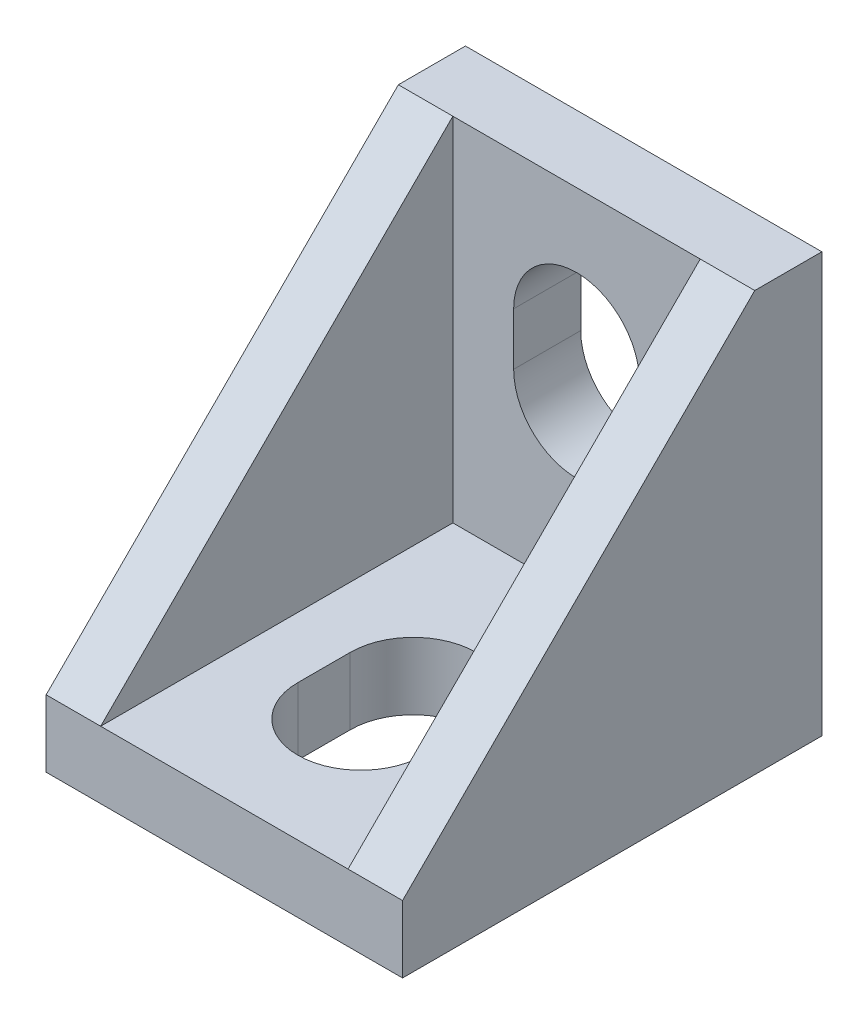
ISO-10303-21;
HEADER;
FILE_DESCRIPTION(('STEP AP214'),'2;1');
FILE_NAME('part.step','',(''),(''),'','','');
FILE_SCHEMA(('AUTOMOTIVE_DESIGN { 1 0 10303 214 1 1 1 1 }'));
ENDSEC;
DATA;
#1=APPLICATION_CONTEXT('core data for automotive mechanical design processes');
#2=APPLICATION_PROTOCOL_DEFINITION('international standard','automotive_design',2000,#1);
#3=PRODUCT_CONTEXT('',#1,'mechanical');
#4=PRODUCT('Part','Part','',(#3));
#5=PRODUCT_RELATED_PRODUCT_CATEGORY('part','',(#4));
#6=PRODUCT_DEFINITION_FORMATION('','',#4);
#7=PRODUCT_DEFINITION_CONTEXT('part definition',#1,'design');
#8=PRODUCT_DEFINITION('design','',#6,#7);
#9=PRODUCT_DEFINITION_SHAPE('','',#8);
#10=(LENGTH_UNIT() NAMED_UNIT(*) SI_UNIT(.MILLI.,.METRE.));
#11=(NAMED_UNIT(*) PLANE_ANGLE_UNIT() SI_UNIT($,.RADIAN.));
#12=(NAMED_UNIT(*) SI_UNIT($,.STERADIAN.) SOLID_ANGLE_UNIT());
#13=UNCERTAINTY_MEASURE_WITH_UNIT(LENGTH_MEASURE(1.E-05),#10,'distance_accuracy_value','');
#14=(GEOMETRIC_REPRESENTATION_CONTEXT(3) GLOBAL_UNCERTAINTY_ASSIGNED_CONTEXT((#13)) GLOBAL_UNIT_ASSIGNED_CONTEXT((#10,
#11,#12)) REPRESENTATION_CONTEXT('',''));
#15=CARTESIAN_POINT('',(0.,0.,0.));
#16=DIRECTION('',(0.,0.,1.));
#17=DIRECTION('',(1.,0.,0.));
#18=AXIS2_PLACEMENT_3D('',#15,#16,#17);
#19=CARTESIAN_POINT('',(-8.5,-6.8,20.));
#20=DIRECTION('',(0.,-1.,0.));
#21=DIRECTION('',(0.,0.,-1.));
#22=AXIS2_PLACEMENT_3D('',#19,#20,#21);
#23=PLANE('',#22);
#24=DIRECTION('',(0.,0.,1.));
#25=VECTOR('',#24,1.);
#26=CARTESIAN_POINT('',(5.9,-6.8,20.));
#27=LINE('',#26,#25);
#28=CARTESIAN_POINT('',(5.9,-6.8,3.2));
#29=VERTEX_POINT('',#28);
#30=CARTESIAN_POINT('',(5.9,-6.8,20.));
#31=VERTEX_POINT('',#30);
#32=EDGE_CURVE('E220',#29,#31,#27,.T.);
#33=ORIENTED_EDGE('',*,*,#32,.F.);
#34=DIRECTION('',(-1.,0.,0.));
#35=VECTOR('',#34,1.);
#36=CARTESIAN_POINT('',(-8.5,-6.8,3.2));
#37=LINE('',#36,#35);
#38=CARTESIAN_POINT('',(-5.9,-6.8,3.2));
#39=VERTEX_POINT('',#38);
#40=EDGE_CURVE('E38',#29,#39,#37,.T.);
#41=ORIENTED_EDGE('',*,*,#40,.T.);
#42=DIRECTION('',(0.,0.,1.));
#43=VECTOR('',#42,1.);
#44=CARTESIAN_POINT('',(-5.9,-6.8,20.));
#45=LINE('',#44,#43);
#46=CARTESIAN_POINT('',(-5.9,-6.8,20.));
#47=VERTEX_POINT('',#46);
#48=EDGE_CURVE('E228',#39,#47,#45,.T.);
#49=ORIENTED_EDGE('',*,*,#48,.T.);
#50=DIRECTION('',(-1.,0.,0.));
#51=VECTOR('',#50,1.);
#52=CARTESIAN_POINT('',(-8.5,-6.8,20.));
#53=LINE('',#52,#51);
#54=EDGE_CURVE('E250',#31,#47,#53,.T.);
#55=ORIENTED_EDGE('',*,*,#54,.F.);
#56=EDGE_LOOP('',(#33,#41,#49,#55));
#57=FACE_BOUND('',#56,.T.);
#58=CARTESIAN_POINT('',(0.,-6.8,13.4950710758014));
#59=DIRECTION('',(0.,-1.,0.));
#60=DIRECTION('',(1.,0.,0.));
#61=AXIS2_PLACEMENT_3D('',#58,#59,#60);
#62=CIRCLE('',#61,3.);
#63=CARTESIAN_POINT('',(3.,-6.8,13.4950710758014));
#64=VERTEX_POINT('',#63);
#65=CARTESIAN_POINT('',(-3.,-6.8,13.4950710758014));
#66=VERTEX_POINT('',#65);
#67=EDGE_CURVE('E51',#64,#66,#62,.T.);
#68=ORIENTED_EDGE('',*,*,#67,.T.);
#69=DIRECTION('',(0.,0.,-1.));
#70=VECTOR('',#69,1.);
#71=CARTESIAN_POINT('',(-3.,-6.8,13.4950710758014));
#72=LINE('',#71,#70);
#73=CARTESIAN_POINT('',(-3.,-6.8,10.9950710758014));
#74=VERTEX_POINT('',#73);
#75=EDGE_CURVE('E165',#66,#74,#72,.T.);
#76=ORIENTED_EDGE('',*,*,#75,.T.);
#77=CARTESIAN_POINT('',(0.,-6.8,10.9950710758014));
#78=DIRECTION('',(0.,-1.,0.));
#79=DIRECTION('',(1.,0.,0.));
#80=AXIS2_PLACEMENT_3D('',#77,#78,#79);
#81=CIRCLE('',#80,3.);
#82=CARTESIAN_POINT('',(3.,-6.8,10.9950710758014));
#83=VERTEX_POINT('',#82);
#84=EDGE_CURVE('E168',#74,#83,#81,.T.);
#85=ORIENTED_EDGE('',*,*,#84,.T.);
#86=DIRECTION('',(0.,0.,1.));
#87=VECTOR('',#86,1.);
#88=CARTESIAN_POINT('',(3.,-6.8,13.4950710758014));
#89=LINE('',#88,#87);
#90=EDGE_CURVE('E174',#83,#64,#89,.T.);
#91=ORIENTED_EDGE('',*,*,#90,.T.);
#92=EDGE_LOOP('',(#68,#76,#85,#91));
#93=FACE_BOUND('',#92,.T.);
#94=ADVANCED_FACE('F34',(#57,#93),#23,.F.);
#95=CARTESIAN_POINT('',(-8.5,-10.,3.2));
#96=DIRECTION('',(0.,1.,0.));
#97=DIRECTION('',(0.,0.,1.));
#98=AXIS2_PLACEMENT_3D('',#95,#96,#97);
#99=PLANE('',#98);
#100=DIRECTION('',(1.,0.,0.));
#101=VECTOR('',#100,1.);
#102=CARTESIAN_POINT('',(-8.5,-10.,0.));
#103=LINE('',#102,#101);
#104=CARTESIAN_POINT('',(-8.5,-10.,0.));
#105=VERTEX_POINT('',#104);
#106=CARTESIAN_POINT('',(8.5,-10.,0.));
#107=VERTEX_POINT('',#106);
#108=EDGE_CURVE('E267',#105,#107,#103,.T.);
#109=ORIENTED_EDGE('',*,*,#108,.T.);
#110=DIRECTION('',(0.,0.,-1.));
#111=VECTOR('',#110,1.);
#112=CARTESIAN_POINT('',(8.5,-10.,3.2));
#113=LINE('',#112,#111);
#114=CARTESIAN_POINT('',(8.5,-10.,20.));
#115=VERTEX_POINT('',#114);
#116=EDGE_CURVE('E259',#115,#107,#113,.T.);
#117=ORIENTED_EDGE('',*,*,#116,.F.);
#118=DIRECTION('',(1.,0.,0.));
#119=VECTOR('',#118,1.);
#120=CARTESIAN_POINT('',(-8.5,-10.,20.));
#121=LINE('',#120,#119);
#122=CARTESIAN_POINT('',(-8.5,-10.,20.));
#123=VERTEX_POINT('',#122);
#124=EDGE_CURVE('E244',#123,#115,#121,.T.);
#125=ORIENTED_EDGE('',*,*,#124,.F.);
#126=DIRECTION('',(0.,0.,-1.));
#127=VECTOR('',#126,1.);
#128=CARTESIAN_POINT('',(-8.5,-10.,3.2));
#129=LINE('',#128,#127);
#130=EDGE_CURVE('E271',#123,#105,#129,.T.);
#131=ORIENTED_EDGE('',*,*,#130,.T.);
#132=EDGE_LOOP('',(#109,#117,#125,#131));
#133=FACE_BOUND('',#132,.T.);
#134=CARTESIAN_POINT('',(0.,-10.,13.4950710758014));
#135=DIRECTION('',(0.,-1.,0.));
#136=DIRECTION('',(1.,0.,0.));
#137=AXIS2_PLACEMENT_3D('',#134,#135,#136);
#138=CIRCLE('',#137,3.);
#139=CARTESIAN_POINT('',(3.,-10.,13.4950710758014));
#140=VERTEX_POINT('',#139);
#141=CARTESIAN_POINT('',(-3.,-10.,13.4950710758014));
#142=VERTEX_POINT('',#141);
#143=EDGE_CURVE('E157',#140,#142,#138,.T.);
#144=ORIENTED_EDGE('',*,*,#143,.F.);
#145=DIRECTION('',(0.,0.,1.));
#146=VECTOR('',#145,1.);
#147=CARTESIAN_POINT('',(3.,-10.,13.4950710758014));
#148=LINE('',#147,#146);
#149=CARTESIAN_POINT('',(3.,-10.,10.9950710758014));
#150=VERTEX_POINT('',#149);
#151=EDGE_CURVE('E149',#150,#140,#148,.T.);
#152=ORIENTED_EDGE('',*,*,#151,.F.);
#153=CARTESIAN_POINT('',(0.,-10.,10.9950710758014));
#154=DIRECTION('',(0.,-1.,0.));
#155=DIRECTION('',(1.,0.,0.));
#156=AXIS2_PLACEMENT_3D('',#153,#154,#155);
#157=CIRCLE('',#156,3.);
#158=CARTESIAN_POINT('',(-3.,-10.,10.9950710758014));
#159=VERTEX_POINT('',#158);
#160=EDGE_CURVE('E156',#159,#150,#157,.T.);
#161=ORIENTED_EDGE('',*,*,#160,.F.);
#162=DIRECTION('',(0.,0.,-1.));
#163=VECTOR('',#162,1.);
#164=CARTESIAN_POINT('',(-3.,-10.,13.4950710758014));
#165=LINE('',#164,#163);
#166=EDGE_CURVE('E161',#142,#159,#165,.T.);
#167=ORIENTED_EDGE('',*,*,#166,.F.);
#168=EDGE_LOOP('',(#144,#152,#161,#167));
#169=FACE_BOUND('',#168,.T.);
#170=ADVANCED_FACE('F164',(#133,#169),#99,.F.);
#171=CARTESIAN_POINT('',(8.5,-10.,3.2));
#172=DIRECTION('',(0.,0.,1.));
#173=DIRECTION('',(1.,0.,0.));
#174=AXIS2_PLACEMENT_3D('',#171,#172,#173);
#175=PLANE('',#174);
#176=CARTESIAN_POINT('',(0.,3.49507107580138,3.2));
#177=DIRECTION('',(0.,0.,1.));
#178=DIRECTION('',(1.,0.,0.));
#179=AXIS2_PLACEMENT_3D('',#176,#177,#178);
#180=CIRCLE('',#179,3.);
#181=CARTESIAN_POINT('',(3.,3.49507107580138,3.2));
#182=VERTEX_POINT('',#181);
#183=CARTESIAN_POINT('',(-3.,3.49507107580138,3.2));
#184=VERTEX_POINT('',#183);
#185=EDGE_CURVE('E180',#182,#184,#180,.T.);
#186=ORIENTED_EDGE('',*,*,#185,.F.);
#187=DIRECTION('',(0.,1.,0.));
#188=VECTOR('',#187,1.);
#189=CARTESIAN_POINT('',(3.,3.49507107580138,3.2));
#190=LINE('',#189,#188);
#191=CARTESIAN_POINT('',(3.,0.995071075801377,3.2));
#192=VERTEX_POINT('',#191);
#193=EDGE_CURVE('E188',#192,#182,#190,.T.);
#194=ORIENTED_EDGE('',*,*,#193,.F.);
#195=CARTESIAN_POINT('',(0.,0.995071075801377,3.2));
#196=DIRECTION('',(0.,0.,1.));
#197=DIRECTION('',(1.,0.,0.));
#198=AXIS2_PLACEMENT_3D('',#195,#196,#197);
#199=CIRCLE('',#198,3.);
#200=CARTESIAN_POINT('',(-3.,0.995071075801377,3.2));
#201=VERTEX_POINT('',#200);
#202=EDGE_CURVE('E202',#201,#192,#199,.T.);
#203=ORIENTED_EDGE('',*,*,#202,.F.);
#204=DIRECTION('',(0.,-1.,0.));
#205=VECTOR('',#204,1.);
#206=CARTESIAN_POINT('',(-3.,3.49507107580138,3.2));
#207=LINE('',#206,#205);
#208=EDGE_CURVE('E199',#184,#201,#207,.T.);
#209=ORIENTED_EDGE('',*,*,#208,.F.);
#210=EDGE_LOOP('',(#186,#194,#203,#209));
#211=FACE_BOUND('',#210,.T.);
#212=ORIENTED_EDGE('',*,*,#40,.F.);
#213=DIRECTION('',(0.,-1.,0.));
#214=VECTOR('',#213,1.);
#215=CARTESIAN_POINT('',(5.9,-6.8,3.2));
#216=LINE('',#215,#214);
#217=CARTESIAN_POINT('',(5.9,10.,3.2));
#218=VERTEX_POINT('',#217);
#219=EDGE_CURVE('E216',#218,#29,#216,.T.);
#220=ORIENTED_EDGE('',*,*,#219,.F.);
#221=DIRECTION('',(-1.,0.,0.));
#222=VECTOR('',#221,1.);
#223=CARTESIAN_POINT('',(-8.5,10.,3.2));
#224=LINE('',#223,#222);
#225=CARTESIAN_POINT('',(-5.9,10.,3.2));
#226=VERTEX_POINT('',#225);
#227=EDGE_CURVE('E260',#218,#226,#224,.T.);
#228=ORIENTED_EDGE('',*,*,#227,.T.);
#229=DIRECTION('',(0.,-1.,0.));
#230=VECTOR('',#229,1.);
#231=CARTESIAN_POINT('',(-5.9,-6.8,3.2));
#232=LINE('',#231,#230);
#233=EDGE_CURVE('E225',#226,#39,#232,.T.);
#234=ORIENTED_EDGE('',*,*,#233,.T.);
#235=EDGE_LOOP('',(#212,#220,#228,#234));
#236=FACE_BOUND('',#235,.T.);
#237=ADVANCED_FACE('F309',(#211,#236),#175,.T.);
#238=CARTESIAN_POINT('',(8.5,10.,3.2));
#239=DIRECTION('',(-1.,0.,0.));
#240=DIRECTION('',(0.,-1.,0.));
#241=AXIS2_PLACEMENT_3D('',#238,#239,#240);
#242=PLANE('',#241);
#243=DIRECTION('',(0.,0.,-1.));
#244=VECTOR('',#243,1.);
#245=CARTESIAN_POINT('',(8.5,10.,3.2));
#246=LINE('',#245,#244);
#247=CARTESIAN_POINT('',(8.5,10.,3.2));
#248=VERTEX_POINT('',#247);
#249=CARTESIAN_POINT('',(8.5,10.,0.));
#250=VERTEX_POINT('',#249);
#251=EDGE_CURVE('E11',#248,#250,#246,.T.);
#252=ORIENTED_EDGE('',*,*,#251,.F.);
#253=DIRECTION('',(0.,0.707106781186548,-0.707106781186548));
#254=VECTOR('',#253,1.);
#255=CARTESIAN_POINT('',(8.5,10.,3.2));
#256=LINE('',#255,#254);
#257=CARTESIAN_POINT('',(8.5,-6.8,20.));
#258=VERTEX_POINT('',#257);
#259=EDGE_CURVE('E209',#258,#248,#256,.T.);
#260=ORIENTED_EDGE('',*,*,#259,.F.);
#261=DIRECTION('',(0.,1.,0.));
#262=VECTOR('',#261,1.);
#263=CARTESIAN_POINT('',(8.5,-10.,20.));
#264=LINE('',#263,#262);
#265=EDGE_CURVE('E247',#115,#258,#264,.T.);
#266=ORIENTED_EDGE('',*,*,#265,.F.);
#267=ORIENTED_EDGE('',*,*,#116,.T.);
#268=DIRECTION('',(0.,1.,0.));
#269=VECTOR('',#268,1.);
#270=CARTESIAN_POINT('',(8.5,10.,0.));
#271=LINE('',#270,#269);
#272=EDGE_CURVE('E253',#107,#250,#271,.T.);
#273=ORIENTED_EDGE('',*,*,#272,.T.);
#274=EDGE_LOOP('',(#252,#260,#266,#267,#273));
#275=FACE_BOUND('',#274,.T.);
#276=ADVANCED_FACE('F36',(#275),#242,.F.);
#277=CARTESIAN_POINT('',(-8.5,10.,3.2));
#278=DIRECTION('',(0.,-1.,0.));
#279=DIRECTION('',(0.,0.,-1.));
#280=AXIS2_PLACEMENT_3D('',#277,#278,#279);
#281=PLANE('',#280);
#282=DIRECTION('',(-1.,0.,0.));
#283=VECTOR('',#282,1.);
#284=CARTESIAN_POINT('',(-8.5,10.,0.));
#285=LINE('',#284,#283);
#286=CARTESIAN_POINT('',(-8.5,10.,0.));
#287=VERTEX_POINT('',#286);
#288=EDGE_CURVE('E263',#250,#287,#285,.T.);
#289=ORIENTED_EDGE('',*,*,#288,.T.);
#290=DIRECTION('',(0.,0.,-1.));
#291=VECTOR('',#290,1.);
#292=CARTESIAN_POINT('',(-8.5,10.,3.2));
#293=LINE('',#292,#291);
#294=CARTESIAN_POINT('',(-8.5,10.,3.2));
#295=VERTEX_POINT('',#294);
#296=EDGE_CURVE('E44',#295,#287,#293,.T.);
#297=ORIENTED_EDGE('',*,*,#296,.F.);
#298=DIRECTION('',(-1.,0.,0.));
#299=VECTOR('',#298,1.);
#300=CARTESIAN_POINT('',(-5.9,10.,3.2));
#301=LINE('',#300,#299);
#302=EDGE_CURVE('E237',#226,#295,#301,.T.);
#303=ORIENTED_EDGE('',*,*,#302,.F.);
#304=ORIENTED_EDGE('',*,*,#227,.F.);
#305=EDGE_CURVE('E256',#248,#218,#224,.T.);
#306=ORIENTED_EDGE('',*,*,#305,.F.);
#307=ORIENTED_EDGE('',*,*,#251,.T.);
#308=EDGE_LOOP('',(#289,#297,#303,#304,#306,#307));
#309=FACE_BOUND('',#308,.T.);
#310=ADVANCED_FACE('F312',(#309),#281,.F.);
#311=CARTESIAN_POINT('',(-8.5,10.,3.2));
#312=DIRECTION('',(1.,0.,0.));
#313=DIRECTION('',(0.,1.,0.));
#314=AXIS2_PLACEMENT_3D('',#311,#312,#313);
#315=PLANE('',#314);
#316=DIRECTION('',(0.,-1.,0.));
#317=VECTOR('',#316,1.);
#318=CARTESIAN_POINT('',(-8.5,10.,0.));
#319=LINE('',#318,#317);
#320=EDGE_CURVE('E265',#287,#105,#319,.T.);
#321=ORIENTED_EDGE('',*,*,#320,.T.);
#322=ORIENTED_EDGE('',*,*,#130,.F.);
#323=DIRECTION('',(0.,-1.,0.));
#324=VECTOR('',#323,1.);
#325=CARTESIAN_POINT('',(-8.5,-10.,20.));
#326=LINE('',#325,#324);
#327=CARTESIAN_POINT('',(-8.5,-6.8,20.));
#328=VERTEX_POINT('',#327);
#329=EDGE_CURVE('E241',#328,#123,#326,.T.);
#330=ORIENTED_EDGE('',*,*,#329,.F.);
#331=DIRECTION('',(0.,0.707106781186548,-0.707106781186548));
#332=VECTOR('',#331,1.);
#333=CARTESIAN_POINT('',(-8.5,10.,3.2));
#334=LINE('',#333,#332);
#335=EDGE_CURVE('E223',#328,#295,#334,.T.);
#336=ORIENTED_EDGE('',*,*,#335,.T.);
#337=ORIENTED_EDGE('',*,*,#296,.T.);
#338=EDGE_LOOP('',(#321,#322,#330,#336,#337));
#339=FACE_BOUND('',#338,.T.);
#340=ADVANCED_FACE('F278',(#339),#315,.F.);
#341=CARTESIAN_POINT('',(8.5,-10.,0.));
#342=DIRECTION('',(0.,0.,1.));
#343=DIRECTION('',(1.,0.,0.));
#344=AXIS2_PLACEMENT_3D('',#341,#342,#343);
#345=PLANE('',#344);
#346=DIRECTION('',(0.,1.,0.));
#347=VECTOR('',#346,1.);
#348=CARTESIAN_POINT('',(3.,3.49507107580138,0.));
#349=LINE('',#348,#347);
#350=CARTESIAN_POINT('',(3.,0.995071075801377,0.));
#351=VERTEX_POINT('',#350);
#352=CARTESIAN_POINT('',(3.,3.49507107580138,0.));
#353=VERTEX_POINT('',#352);
#354=EDGE_CURVE('E194',#351,#353,#349,.T.);
#355=ORIENTED_EDGE('',*,*,#354,.T.);
#356=CARTESIAN_POINT('',(0.,3.49507107580138,0.));
#357=DIRECTION('',(0.,0.,1.));
#358=DIRECTION('',(1.,0.,0.));
#359=AXIS2_PLACEMENT_3D('',#356,#357,#358);
#360=CIRCLE('',#359,3.);
#361=CARTESIAN_POINT('',(-3.,3.49507107580138,0.));
#362=VERTEX_POINT('',#361);
#363=EDGE_CURVE('E184',#353,#362,#360,.T.);
#364=ORIENTED_EDGE('',*,*,#363,.T.);
#365=DIRECTION('',(0.,-1.,0.));
#366=VECTOR('',#365,1.);
#367=CARTESIAN_POINT('',(-3.,3.49507107580138,0.));
#368=LINE('',#367,#366);
#369=CARTESIAN_POINT('',(-3.,0.995071075801377,0.));
#370=VERTEX_POINT('',#369);
#371=EDGE_CURVE('E187',#362,#370,#368,.T.);
#372=ORIENTED_EDGE('',*,*,#371,.T.);
#373=CARTESIAN_POINT('',(0.,0.995071075801377,0.));
#374=DIRECTION('',(0.,0.,1.));
#375=DIRECTION('',(1.,0.,0.));
#376=AXIS2_PLACEMENT_3D('',#373,#374,#375);
#377=CIRCLE('',#376,3.);
#378=EDGE_CURVE('E191',#370,#351,#377,.T.);
#379=ORIENTED_EDGE('',*,*,#378,.T.);
#380=EDGE_LOOP('',(#355,#364,#372,#379));
#381=FACE_BOUND('',#380,.T.);
#382=ORIENTED_EDGE('',*,*,#272,.F.);
#383=ORIENTED_EDGE('',*,*,#108,.F.);
#384=ORIENTED_EDGE('',*,*,#320,.F.);
#385=ORIENTED_EDGE('',*,*,#288,.F.);
#386=EDGE_LOOP('',(#382,#383,#384,#385));
#387=FACE_BOUND('',#386,.T.);
#388=ADVANCED_FACE('F285',(#381,#387),#345,.F.);
#389=CARTESIAN_POINT('',(-8.5,-6.8,20.));
#390=DIRECTION('',(0.,0.,-1.));
#391=DIRECTION('',(-1.,0.,0.));
#392=AXIS2_PLACEMENT_3D('',#389,#390,#391);
#393=PLANE('',#392);
#394=ORIENTED_EDGE('',*,*,#329,.T.);
#395=ORIENTED_EDGE('',*,*,#124,.T.);
#396=ORIENTED_EDGE('',*,*,#265,.T.);
#397=EDGE_CURVE('E251',#258,#31,#53,.T.);
#398=ORIENTED_EDGE('',*,*,#397,.T.);
#399=ORIENTED_EDGE('',*,*,#54,.T.);
#400=DIRECTION('',(-1.,0.,0.));
#401=VECTOR('',#400,1.);
#402=CARTESIAN_POINT('',(-5.9,-6.8,20.));
#403=LINE('',#402,#401);
#404=EDGE_CURVE('E234',#47,#328,#403,.T.);
#405=ORIENTED_EDGE('',*,*,#404,.T.);
#406=EDGE_LOOP('',(#394,#395,#396,#398,#399,#405));
#407=FACE_BOUND('',#406,.T.);
#408=ADVANCED_FACE('F293',(#407),#393,.F.);
#409=CARTESIAN_POINT('',(-5.9,10.,3.2));
#410=DIRECTION('',(0.,0.707106781186548,0.707106781186548));
#411=DIRECTION('',(0.,-0.707106781186548,0.707106781186548));
#412=AXIS2_PLACEMENT_3D('',#409,#410,#411);
#413=PLANE('',#412);
#414=ORIENTED_EDGE('',*,*,#335,.F.);
#415=ORIENTED_EDGE('',*,*,#404,.F.);
#416=DIRECTION('',(0.,0.707106781186548,-0.707106781186548));
#417=VECTOR('',#416,1.);
#418=CARTESIAN_POINT('',(-5.9,10.,3.2));
#419=LINE('',#418,#417);
#420=EDGE_CURVE('E231',#47,#226,#419,.T.);
#421=ORIENTED_EDGE('',*,*,#420,.T.);
#422=ORIENTED_EDGE('',*,*,#302,.T.);
#423=EDGE_LOOP('',(#414,#415,#421,#422));
#424=FACE_BOUND('',#423,.T.);
#425=ADVANCED_FACE('F298',(#424),#413,.T.);
#426=CARTESIAN_POINT('',(-5.9,-6.8,3.2));
#427=DIRECTION('',(-1.,0.,0.));
#428=DIRECTION('',(0.,-1.,0.));
#429=AXIS2_PLACEMENT_3D('',#426,#427,#428);
#430=PLANE('',#429);
#431=ORIENTED_EDGE('',*,*,#233,.F.);
#432=ORIENTED_EDGE('',*,*,#420,.F.);
#433=ORIENTED_EDGE('',*,*,#48,.F.);
#434=EDGE_LOOP('',(#431,#432,#433));
#435=FACE_BOUND('',#434,.T.);
#436=ADVANCED_FACE('F302',(#435),#430,.F.);
#437=CARTESIAN_POINT('',(5.9,10.,3.2));
#438=DIRECTION('',(0.,-0.707106781186548,-0.707106781186548));
#439=DIRECTION('',(0.,0.707106781186548,-0.707106781186548));
#440=AXIS2_PLACEMENT_3D('',#437,#438,#439);
#441=PLANE('',#440);
#442=ORIENTED_EDGE('',*,*,#259,.T.);
#443=ORIENTED_EDGE('',*,*,#305,.T.);
#444=DIRECTION('',(0.,0.707106781186548,-0.707106781186548));
#445=VECTOR('',#444,1.);
#446=CARTESIAN_POINT('',(5.9,10.,3.2));
#447=LINE('',#446,#445);
#448=EDGE_CURVE('E218',#31,#218,#447,.T.);
#449=ORIENTED_EDGE('',*,*,#448,.F.);
#450=ORIENTED_EDGE('',*,*,#397,.F.);
#451=EDGE_LOOP('',(#442,#443,#449,#450));
#452=FACE_BOUND('',#451,.T.);
#453=ADVANCED_FACE('F314',(#452),#441,.F.);
#454=CARTESIAN_POINT('',(5.9,-6.8,3.2));
#455=DIRECTION('',(1.,0.,0.));
#456=DIRECTION('',(0.,-1.,0.));
#457=AXIS2_PLACEMENT_3D('',#454,#455,#456);
#458=PLANE('',#457);
#459=ORIENTED_EDGE('',*,*,#219,.T.);
#460=ORIENTED_EDGE('',*,*,#32,.T.);
#461=ORIENTED_EDGE('',*,*,#448,.T.);
#462=EDGE_LOOP('',(#459,#460,#461));
#463=FACE_BOUND('',#462,.T.);
#464=ADVANCED_FACE('F316',(#463),#458,.F.);
#465=CARTESIAN_POINT('',(0.,3.49507107580138,0.));
#466=DIRECTION('',(0.,0.,1.));
#467=DIRECTION('',(1.,0.,0.));
#468=AXIS2_PLACEMENT_3D('',#465,#466,#467);
#469=CYLINDRICAL_SURFACE('',#468,3.);
#470=ORIENTED_EDGE('',*,*,#185,.T.);
#471=DIRECTION('',(0.,0.,1.));
#472=VECTOR('',#471,1.);
#473=CARTESIAN_POINT('',(-3.,3.49507107580138,0.));
#474=LINE('',#473,#472);
#475=EDGE_CURVE('E197',#362,#184,#474,.T.);
#476=ORIENTED_EDGE('',*,*,#475,.F.);
#477=ORIENTED_EDGE('',*,*,#363,.F.);
#478=DIRECTION('',(0.,0.,1.));
#479=VECTOR('',#478,1.);
#480=CARTESIAN_POINT('',(3.,3.49507107580138,0.));
#481=LINE('',#480,#479);
#482=EDGE_CURVE('E207',#353,#182,#481,.T.);
#483=ORIENTED_EDGE('',*,*,#482,.T.);
#484=EDGE_LOOP('',(#470,#476,#477,#483));
#485=FACE_BOUND('',#484,.T.);
#486=ADVANCED_FACE('F318',(#485),#469,.F.);
#487=CARTESIAN_POINT('',(3.,3.49507107580138,0.));
#488=DIRECTION('',(1.,0.,0.));
#489=DIRECTION('',(0.,1.,0.));
#490=AXIS2_PLACEMENT_3D('',#487,#488,#489);
#491=PLANE('',#490);
#492=ORIENTED_EDGE('',*,*,#193,.T.);
#493=ORIENTED_EDGE('',*,*,#482,.F.);
#494=ORIENTED_EDGE('',*,*,#354,.F.);
#495=DIRECTION('',(0.,0.,1.));
#496=VECTOR('',#495,1.);
#497=CARTESIAN_POINT('',(3.,0.995071075801377,0.));
#498=LINE('',#497,#496);
#499=EDGE_CURVE('E210',#351,#192,#498,.T.);
#500=ORIENTED_EDGE('',*,*,#499,.T.);
#501=EDGE_LOOP('',(#492,#493,#494,#500));
#502=FACE_BOUND('',#501,.T.);
#503=ADVANCED_FACE('F324',(#502),#491,.F.);
#504=CARTESIAN_POINT('',(0.,0.995071075801377,0.));
#505=DIRECTION('',(0.,0.,1.));
#506=DIRECTION('',(1.,0.,0.));
#507=AXIS2_PLACEMENT_3D('',#504,#505,#506);
#508=CYLINDRICAL_SURFACE('',#507,3.);
#509=ORIENTED_EDGE('',*,*,#202,.T.);
#510=ORIENTED_EDGE('',*,*,#499,.F.);
#511=ORIENTED_EDGE('',*,*,#378,.F.);
#512=DIRECTION('',(0.,0.,1.));
#513=VECTOR('',#512,1.);
#514=CARTESIAN_POINT('',(-3.,0.995071075801377,0.));
#515=LINE('',#514,#513);
#516=EDGE_CURVE('E212',#370,#201,#515,.T.);
#517=ORIENTED_EDGE('',*,*,#516,.T.);
#518=EDGE_LOOP('',(#509,#510,#511,#517));
#519=FACE_BOUND('',#518,.T.);
#520=ADVANCED_FACE('F409',(#519),#508,.F.);
#521=CARTESIAN_POINT('',(-3.,3.49507107580138,0.));
#522=DIRECTION('',(-1.,0.,0.));
#523=DIRECTION('',(0.,-1.,0.));
#524=AXIS2_PLACEMENT_3D('',#521,#522,#523);
#525=PLANE('',#524);
#526=ORIENTED_EDGE('',*,*,#208,.T.);
#527=ORIENTED_EDGE('',*,*,#516,.F.);
#528=ORIENTED_EDGE('',*,*,#371,.F.);
#529=ORIENTED_EDGE('',*,*,#475,.T.);
#530=EDGE_LOOP('',(#526,#527,#528,#529));
#531=FACE_BOUND('',#530,.T.);
#532=ADVANCED_FACE('F374',(#531),#525,.F.);
#533=CARTESIAN_POINT('',(0.,-10.,13.4950710758014));
#534=DIRECTION('',(0.,1.,0.));
#535=DIRECTION('',(0.,0.,1.));
#536=AXIS2_PLACEMENT_3D('',#533,#534,#535);
#537=CYLINDRICAL_SURFACE('',#536,3.);
#538=ORIENTED_EDGE('',*,*,#67,.F.);
#539=DIRECTION('',(0.,1.,0.));
#540=VECTOR('',#539,1.);
#541=CARTESIAN_POINT('',(3.,-10.,13.4950710758014));
#542=LINE('',#541,#540);
#543=EDGE_CURVE('E151',#140,#64,#542,.T.);
#544=ORIENTED_EDGE('',*,*,#543,.F.);
#545=ORIENTED_EDGE('',*,*,#143,.T.);
#546=DIRECTION('',(0.,1.,0.));
#547=VECTOR('',#546,1.);
#548=CARTESIAN_POINT('',(-3.,-10.,13.4950710758014));
#549=LINE('',#548,#547);
#550=EDGE_CURVE('E178',#142,#66,#549,.T.);
#551=ORIENTED_EDGE('',*,*,#550,.T.);
#552=EDGE_LOOP('',(#538,#544,#545,#551));
#553=FACE_BOUND('',#552,.T.);
#554=ADVANCED_FACE('F159',(#553),#537,.F.);
#555=CARTESIAN_POINT('',(-3.,-10.,13.4950710758014));
#556=DIRECTION('',(1.,0.,0.));
#557=DIRECTION('',(0.,0.,-1.));
#558=AXIS2_PLACEMENT_3D('',#555,#556,#557);
#559=PLANE('',#558);
#560=ORIENTED_EDGE('',*,*,#75,.F.);
#561=ORIENTED_EDGE('',*,*,#550,.F.);
#562=ORIENTED_EDGE('',*,*,#166,.T.);
#563=DIRECTION('',(0.,1.,0.));
#564=VECTOR('',#563,1.);
#565=CARTESIAN_POINT('',(-3.,-10.,10.9950710758014));
#566=LINE('',#565,#564);
#567=EDGE_CURVE('E181',#159,#74,#566,.T.);
#568=ORIENTED_EDGE('',*,*,#567,.T.);
#569=EDGE_LOOP('',(#560,#561,#562,#568));
#570=FACE_BOUND('',#569,.T.);
#571=ADVANCED_FACE('F373',(#570),#559,.T.);
#572=CARTESIAN_POINT('',(0.,-10.,10.9950710758014));
#573=DIRECTION('',(0.,1.,0.));
#574=DIRECTION('',(0.,0.,1.));
#575=AXIS2_PLACEMENT_3D('',#572,#573,#574);
#576=CYLINDRICAL_SURFACE('',#575,3.);
#577=ORIENTED_EDGE('',*,*,#84,.F.);
#578=ORIENTED_EDGE('',*,*,#567,.F.);
#579=ORIENTED_EDGE('',*,*,#160,.T.);
#580=DIRECTION('',(0.,1.,0.));
#581=VECTOR('',#580,1.);
#582=CARTESIAN_POINT('',(3.,-10.,10.9950710758014));
#583=LINE('',#582,#581);
#584=EDGE_CURVE('E59',#150,#83,#583,.T.);
#585=ORIENTED_EDGE('',*,*,#584,.T.);
#586=EDGE_LOOP('',(#577,#578,#579,#585));
#587=FACE_BOUND('',#586,.T.);
#588=ADVANCED_FACE('F384',(#587),#576,.F.);
#589=CARTESIAN_POINT('',(3.,-10.,13.4950710758014));
#590=DIRECTION('',(-1.,0.,0.));
#591=DIRECTION('',(0.,0.,1.));
#592=AXIS2_PLACEMENT_3D('',#589,#590,#591);
#593=PLANE('',#592);
#594=ORIENTED_EDGE('',*,*,#90,.F.);
#595=ORIENTED_EDGE('',*,*,#584,.F.);
#596=ORIENTED_EDGE('',*,*,#151,.T.);
#597=ORIENTED_EDGE('',*,*,#543,.T.);
#598=EDGE_LOOP('',(#594,#595,#596,#597));
#599=FACE_BOUND('',#598,.T.);
#600=ADVANCED_FACE('F150',(#599),#593,.T.);
#601=CLOSED_SHELL('',(#94,#170,#237,#276,#310,#340,#388,#408,#425,#436,#453,#464,#486,#503,#520,
#532,#554,#571,#588,#600));
#602=MANIFOLD_SOLID_BREP('B2',#601);
#603=ADVANCED_BREP_SHAPE_REPRESENTATION('',(#18,#602),#14);
#604=SHAPE_DEFINITION_REPRESENTATION(#9,#603);
ENDSEC;
END-ISO-10303-21;
